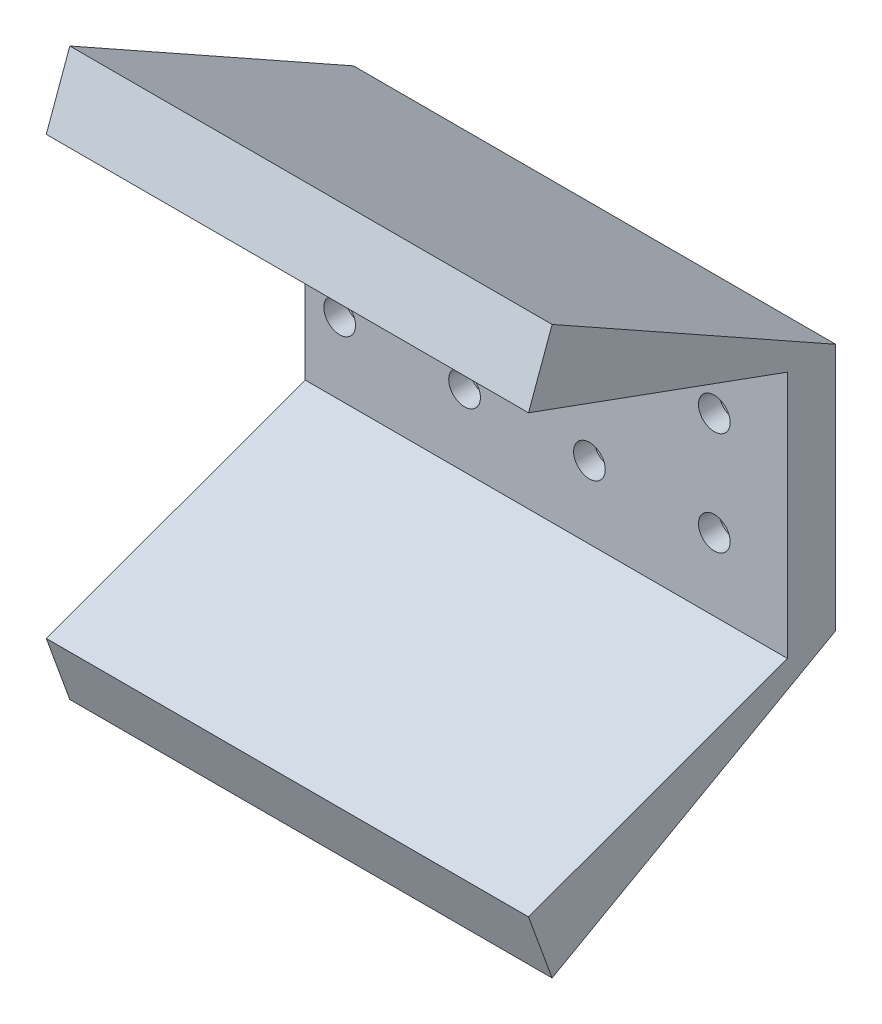
ISO-10303-21;
HEADER;
FILE_DESCRIPTION(('STEP AP214'),'2;1');
FILE_NAME('part.step','',(''),(''),'','','');
FILE_SCHEMA(('AUTOMOTIVE_DESIGN { 1 0 10303 214 1 1 1 1 }'));
ENDSEC;
DATA;
#1=APPLICATION_CONTEXT('core data for automotive mechanical design processes');
#2=APPLICATION_PROTOCOL_DEFINITION('international standard','automotive_design',2000,#1);
#3=PRODUCT_CONTEXT('',#1,'mechanical');
#4=PRODUCT('Part','Part','',(#3));
#5=PRODUCT_RELATED_PRODUCT_CATEGORY('part','',(#4));
#6=PRODUCT_DEFINITION_FORMATION('','',#4);
#7=PRODUCT_DEFINITION_CONTEXT('part definition',#1,'design');
#8=PRODUCT_DEFINITION('design','',#6,#7);
#9=PRODUCT_DEFINITION_SHAPE('','',#8);
#10=(LENGTH_UNIT() NAMED_UNIT(*) SI_UNIT(.MILLI.,.METRE.));
#11=(NAMED_UNIT(*) PLANE_ANGLE_UNIT() SI_UNIT($,.RADIAN.));
#12=(NAMED_UNIT(*) SI_UNIT($,.STERADIAN.) SOLID_ANGLE_UNIT());
#13=UNCERTAINTY_MEASURE_WITH_UNIT(LENGTH_MEASURE(1.E-05),#10,'distance_accuracy_value','');
#14=(GEOMETRIC_REPRESENTATION_CONTEXT(3) GLOBAL_UNCERTAINTY_ASSIGNED_CONTEXT((#13)) GLOBAL_UNIT_ASSIGNED_CONTEXT((#10,
#11,#12)) REPRESENTATION_CONTEXT('',''));
#15=CARTESIAN_POINT('',(0.,0.,0.));
#16=DIRECTION('',(0.,0.,1.));
#17=DIRECTION('',(1.,0.,0.));
#18=AXIS2_PLACEMENT_3D('',#15,#16,#17);
#19=CARTESIAN_POINT('',(5.,25.5,7.));
#20=DIRECTION('',(0.,0.,-1.));
#21=DIRECTION('',(-1.,0.,0.));
#22=AXIS2_PLACEMENT_3D('',#19,#20,#21);
#23=CYLINDRICAL_SURFACE('',#22,2.3);
#24=CARTESIAN_POINT('',(5.,25.5,7.));
#25=DIRECTION('',(0.,0.,1.));
#26=DIRECTION('',(1.,0.,0.));
#27=AXIS2_PLACEMENT_3D('',#24,#25,#26);
#28=CIRCLE('',#27,2.3);
#29=CARTESIAN_POINT('',(7.3,25.5,7.));
#30=VERTEX_POINT('',#29);
#31=EDGE_CURVE('E227',#30,#30,#28,.T.);
#32=ORIENTED_EDGE('',*,*,#31,.T.);
#33=EDGE_LOOP('',(#32));
#34=FACE_BOUND('',#33,.T.);
#35=CARTESIAN_POINT('',(5.,25.5,4.));
#36=DIRECTION('',(0.,0.,-1.));
#37=DIRECTION('',(-1.,0.,0.));
#38=AXIS2_PLACEMENT_3D('',#35,#36,#37);
#39=CIRCLE('',#38,2.3);
#40=CARTESIAN_POINT('',(2.7,25.5,4.));
#41=VERTEX_POINT('',#40);
#42=EDGE_CURVE('E47',#41,#41,#39,.T.);
#43=ORIENTED_EDGE('',*,*,#42,.T.);
#44=EDGE_LOOP('',(#43));
#45=FACE_BOUND('',#44,.T.);
#46=ADVANCED_FACE('F43',(#34,#45),#23,.F.);
#47=CARTESIAN_POINT('',(5.,10.5,7.));
#48=DIRECTION('',(0.,0.,-1.));
#49=DIRECTION('',(-1.,0.,0.));
#50=AXIS2_PLACEMENT_3D('',#47,#48,#49);
#51=CYLINDRICAL_SURFACE('',#50,2.3);
#52=CARTESIAN_POINT('',(5.,10.5,7.));
#53=DIRECTION('',(0.,0.,1.));
#54=DIRECTION('',(1.,0.,0.));
#55=AXIS2_PLACEMENT_3D('',#52,#53,#54);
#56=CIRCLE('',#55,2.3);
#57=CARTESIAN_POINT('',(7.3,10.5,7.));
#58=VERTEX_POINT('',#57);
#59=EDGE_CURVE('E224',#58,#58,#56,.T.);
#60=ORIENTED_EDGE('',*,*,#59,.T.);
#61=EDGE_LOOP('',(#60));
#62=FACE_BOUND('',#61,.T.);
#63=CARTESIAN_POINT('',(5.,10.5,4.));
#64=DIRECTION('',(0.,0.,-1.));
#65=DIRECTION('',(-1.,0.,0.));
#66=AXIS2_PLACEMENT_3D('',#63,#64,#65);
#67=CIRCLE('',#66,2.3);
#68=CARTESIAN_POINT('',(2.7,10.5,4.));
#69=VERTEX_POINT('',#68);
#70=EDGE_CURVE('E256',#69,#69,#67,.T.);
#71=ORIENTED_EDGE('',*,*,#70,.T.);
#72=EDGE_LOOP('',(#71));
#73=FACE_BOUND('',#72,.T.);
#74=ADVANCED_FACE('F329',(#62,#73),#51,.F.);
#75=CARTESIAN_POINT('',(23.125,25.5,7.));
#76=DIRECTION('',(0.,0.,-1.));
#77=DIRECTION('',(-1.,0.,0.));
#78=AXIS2_PLACEMENT_3D('',#75,#76,#77);
#79=CYLINDRICAL_SURFACE('',#78,2.3);
#80=CARTESIAN_POINT('',(23.125,25.5,7.));
#81=DIRECTION('',(0.,0.,1.));
#82=DIRECTION('',(1.,0.,0.));
#83=AXIS2_PLACEMENT_3D('',#80,#81,#82);
#84=CIRCLE('',#83,2.3);
#85=CARTESIAN_POINT('',(25.425,25.5,7.));
#86=VERTEX_POINT('',#85);
#87=EDGE_CURVE('E221',#86,#86,#84,.T.);
#88=ORIENTED_EDGE('',*,*,#87,.T.);
#89=EDGE_LOOP('',(#88));
#90=FACE_BOUND('',#89,.T.);
#91=CARTESIAN_POINT('',(23.125,25.5,4.));
#92=DIRECTION('',(0.,0.,-1.));
#93=DIRECTION('',(-1.,0.,0.));
#94=AXIS2_PLACEMENT_3D('',#91,#92,#93);
#95=CIRCLE('',#94,2.3);
#96=CARTESIAN_POINT('',(20.825,25.5,4.));
#97=VERTEX_POINT('',#96);
#98=EDGE_CURVE('E254',#97,#97,#95,.T.);
#99=ORIENTED_EDGE('',*,*,#98,.T.);
#100=EDGE_LOOP('',(#99));
#101=FACE_BOUND('',#100,.T.);
#102=ADVANCED_FACE('F335',(#90,#101),#79,.F.);
#103=CARTESIAN_POINT('',(23.125,10.5,7.));
#104=DIRECTION('',(0.,0.,-1.));
#105=DIRECTION('',(-1.,0.,0.));
#106=AXIS2_PLACEMENT_3D('',#103,#104,#105);
#107=CYLINDRICAL_SURFACE('',#106,2.3);
#108=CARTESIAN_POINT('',(23.125,10.5,7.));
#109=DIRECTION('',(0.,0.,1.));
#110=DIRECTION('',(1.,0.,0.));
#111=AXIS2_PLACEMENT_3D('',#108,#109,#110);
#112=CIRCLE('',#111,2.3);
#113=CARTESIAN_POINT('',(25.425,10.5,7.));
#114=VERTEX_POINT('',#113);
#115=EDGE_CURVE('E218',#114,#114,#112,.T.);
#116=ORIENTED_EDGE('',*,*,#115,.T.);
#117=EDGE_LOOP('',(#116));
#118=FACE_BOUND('',#117,.T.);
#119=CARTESIAN_POINT('',(23.125,10.5,4.));
#120=DIRECTION('',(0.,0.,-1.));
#121=DIRECTION('',(-1.,0.,0.));
#122=AXIS2_PLACEMENT_3D('',#119,#120,#121);
#123=CIRCLE('',#122,2.3);
#124=CARTESIAN_POINT('',(20.825,10.5,4.));
#125=VERTEX_POINT('',#124);
#126=EDGE_CURVE('E251',#125,#125,#123,.T.);
#127=ORIENTED_EDGE('',*,*,#126,.T.);
#128=EDGE_LOOP('',(#127));
#129=FACE_BOUND('',#128,.T.);
#130=ADVANCED_FACE('F393',(#118,#129),#107,.F.);
#131=CARTESIAN_POINT('',(41.25,25.5,7.));
#132=DIRECTION('',(0.,0.,-1.));
#133=DIRECTION('',(-1.,0.,0.));
#134=AXIS2_PLACEMENT_3D('',#131,#132,#133);
#135=CYLINDRICAL_SURFACE('',#134,2.3);
#136=CARTESIAN_POINT('',(41.25,25.5,7.));
#137=DIRECTION('',(0.,0.,1.));
#138=DIRECTION('',(1.,0.,0.));
#139=AXIS2_PLACEMENT_3D('',#136,#137,#138);
#140=CIRCLE('',#139,2.3);
#141=CARTESIAN_POINT('',(43.55,25.5,7.));
#142=VERTEX_POINT('',#141);
#143=EDGE_CURVE('E215',#142,#142,#140,.T.);
#144=ORIENTED_EDGE('',*,*,#143,.T.);
#145=EDGE_LOOP('',(#144));
#146=FACE_BOUND('',#145,.T.);
#147=CARTESIAN_POINT('',(41.25,25.5,4.));
#148=DIRECTION('',(0.,0.,-1.));
#149=DIRECTION('',(-1.,0.,0.));
#150=AXIS2_PLACEMENT_3D('',#147,#148,#149);
#151=CIRCLE('',#150,2.3);
#152=CARTESIAN_POINT('',(38.95,25.5,4.));
#153=VERTEX_POINT('',#152);
#154=EDGE_CURVE('E248',#153,#153,#151,.T.);
#155=ORIENTED_EDGE('',*,*,#154,.T.);
#156=EDGE_LOOP('',(#155));
#157=FACE_BOUND('',#156,.T.);
#158=ADVANCED_FACE('F385',(#146,#157),#135,.F.);
#159=CARTESIAN_POINT('',(41.25,10.5,7.));
#160=DIRECTION('',(0.,0.,-1.));
#161=DIRECTION('',(-1.,0.,0.));
#162=AXIS2_PLACEMENT_3D('',#159,#160,#161);
#163=CYLINDRICAL_SURFACE('',#162,2.3);
#164=CARTESIAN_POINT('',(41.25,10.5,7.));
#165=DIRECTION('',(0.,0.,1.));
#166=DIRECTION('',(1.,0.,0.));
#167=AXIS2_PLACEMENT_3D('',#164,#165,#166);
#168=CIRCLE('',#167,2.3);
#169=CARTESIAN_POINT('',(43.55,10.5,7.));
#170=VERTEX_POINT('',#169);
#171=EDGE_CURVE('E212',#170,#170,#168,.T.);
#172=ORIENTED_EDGE('',*,*,#171,.T.);
#173=EDGE_LOOP('',(#172));
#174=FACE_BOUND('',#173,.T.);
#175=CARTESIAN_POINT('',(41.25,10.5,4.));
#176=DIRECTION('',(0.,0.,-1.));
#177=DIRECTION('',(-1.,0.,0.));
#178=AXIS2_PLACEMENT_3D('',#175,#176,#177);
#179=CIRCLE('',#178,2.3);
#180=CARTESIAN_POINT('',(38.95,10.5,4.));
#181=VERTEX_POINT('',#180);
#182=EDGE_CURVE('E245',#181,#181,#179,.T.);
#183=ORIENTED_EDGE('',*,*,#182,.T.);
#184=EDGE_LOOP('',(#183));
#185=FACE_BOUND('',#184,.T.);
#186=ADVANCED_FACE('F377',(#174,#185),#163,.F.);
#187=CARTESIAN_POINT('',(59.375,25.5,7.));
#188=DIRECTION('',(0.,0.,-1.));
#189=DIRECTION('',(-1.,0.,0.));
#190=AXIS2_PLACEMENT_3D('',#187,#188,#189);
#191=CYLINDRICAL_SURFACE('',#190,2.3);
#192=CARTESIAN_POINT('',(59.375,25.5,7.));
#193=DIRECTION('',(0.,0.,1.));
#194=DIRECTION('',(1.,0.,0.));
#195=AXIS2_PLACEMENT_3D('',#192,#193,#194);
#196=CIRCLE('',#195,2.3);
#197=CARTESIAN_POINT('',(61.675,25.5,7.));
#198=VERTEX_POINT('',#197);
#199=EDGE_CURVE('E209',#198,#198,#196,.T.);
#200=ORIENTED_EDGE('',*,*,#199,.T.);
#201=EDGE_LOOP('',(#200));
#202=FACE_BOUND('',#201,.T.);
#203=CARTESIAN_POINT('',(59.375,25.5,4.));
#204=DIRECTION('',(0.,0.,-1.));
#205=DIRECTION('',(-1.,0.,0.));
#206=AXIS2_PLACEMENT_3D('',#203,#204,#205);
#207=CIRCLE('',#206,2.3);
#208=CARTESIAN_POINT('',(57.075,25.5,4.));
#209=VERTEX_POINT('',#208);
#210=EDGE_CURVE('E242',#209,#209,#207,.T.);
#211=ORIENTED_EDGE('',*,*,#210,.T.);
#212=EDGE_LOOP('',(#211));
#213=FACE_BOUND('',#212,.T.);
#214=ADVANCED_FACE('F368',(#202,#213),#191,.F.);
#215=CARTESIAN_POINT('',(59.375,10.5,7.));
#216=DIRECTION('',(0.,0.,-1.));
#217=DIRECTION('',(-1.,0.,0.));
#218=AXIS2_PLACEMENT_3D('',#215,#216,#217);
#219=CYLINDRICAL_SURFACE('',#218,2.3);
#220=CARTESIAN_POINT('',(59.375,10.5,7.));
#221=DIRECTION('',(0.,0.,1.));
#222=DIRECTION('',(1.,0.,0.));
#223=AXIS2_PLACEMENT_3D('',#220,#221,#222);
#224=CIRCLE('',#223,2.3);
#225=CARTESIAN_POINT('',(61.675,10.5,7.));
#226=VERTEX_POINT('',#225);
#227=EDGE_CURVE('E206',#226,#226,#224,.T.);
#228=ORIENTED_EDGE('',*,*,#227,.T.);
#229=EDGE_LOOP('',(#228));
#230=FACE_BOUND('',#229,.T.);
#231=CARTESIAN_POINT('',(59.375,10.5,4.));
#232=DIRECTION('',(0.,0.,-1.));
#233=DIRECTION('',(-1.,0.,0.));
#234=AXIS2_PLACEMENT_3D('',#231,#232,#233);
#235=CIRCLE('',#234,2.3);
#236=CARTESIAN_POINT('',(57.075,10.5,4.));
#237=VERTEX_POINT('',#236);
#238=EDGE_CURVE('E203',#237,#237,#235,.T.);
#239=ORIENTED_EDGE('',*,*,#238,.T.);
#240=EDGE_LOOP('',(#239));
#241=FACE_BOUND('',#240,.T.);
#242=ADVANCED_FACE('F341',(#230,#241),#219,.F.);
#243=CARTESIAN_POINT('',(0.,0.,7.));
#244=DIRECTION('',(0.,0.,-1.));
#245=DIRECTION('',(-1.,0.,0.));
#246=AXIS2_PLACEMENT_3D('',#243,#244,#245);
#247=PLANE('',#246);
#248=DIRECTION('',(0.,-1.,0.));
#249=VECTOR('',#248,1.);
#250=CARTESIAN_POINT('',(0.,0.,7.));
#251=LINE('',#250,#249);
#252=CARTESIAN_POINT('',(0.,36.,7.));
#253=VERTEX_POINT('',#252);
#254=CARTESIAN_POINT('',(0.,0.,7.));
#255=VERTEX_POINT('',#254);
#256=EDGE_CURVE('E102',#253,#255,#251,.T.);
#257=ORIENTED_EDGE('',*,*,#256,.T.);
#258=DIRECTION('',(1.,0.,0.));
#259=VECTOR('',#258,1.);
#260=CARTESIAN_POINT('',(0.,0.,7.));
#261=LINE('',#260,#259);
#262=CARTESIAN_POINT('',(70.,0.,7.));
#263=VERTEX_POINT('',#262);
#264=EDGE_CURVE('E98',#255,#263,#261,.T.);
#265=ORIENTED_EDGE('',*,*,#264,.T.);
#266=DIRECTION('',(0.,1.,0.));
#267=VECTOR('',#266,1.);
#268=CARTESIAN_POINT('',(70.,0.,7.));
#269=LINE('',#268,#267);
#270=CARTESIAN_POINT('',(70.,36.,7.));
#271=VERTEX_POINT('',#270);
#272=EDGE_CURVE('E53',#263,#271,#269,.T.);
#273=ORIENTED_EDGE('',*,*,#272,.T.);
#274=DIRECTION('',(-1.,0.,0.));
#275=VECTOR('',#274,1.);
#276=CARTESIAN_POINT('',(0.,36.,7.));
#277=LINE('',#276,#275);
#278=EDGE_CURVE('E11',#271,#253,#277,.T.);
#279=ORIENTED_EDGE('',*,*,#278,.T.);
#280=EDGE_LOOP('',(#257,#265,#273,#279));
#281=FACE_BOUND('',#280,.T.);
#282=ORIENTED_EDGE('',*,*,#31,.F.);
#283=EDGE_LOOP('',(#282));
#284=FACE_BOUND('',#283,.T.);
#285=ORIENTED_EDGE('',*,*,#59,.F.);
#286=EDGE_LOOP('',(#285));
#287=FACE_BOUND('',#286,.T.);
#288=ORIENTED_EDGE('',*,*,#87,.F.);
#289=EDGE_LOOP('',(#288));
#290=FACE_BOUND('',#289,.T.);
#291=ORIENTED_EDGE('',*,*,#115,.F.);
#292=EDGE_LOOP('',(#291));
#293=FACE_BOUND('',#292,.T.);
#294=ORIENTED_EDGE('',*,*,#143,.F.);
#295=EDGE_LOOP('',(#294));
#296=FACE_BOUND('',#295,.T.);
#297=ORIENTED_EDGE('',*,*,#171,.F.);
#298=EDGE_LOOP('',(#297));
#299=FACE_BOUND('',#298,.T.);
#300=ORIENTED_EDGE('',*,*,#199,.F.);
#301=EDGE_LOOP('',(#300));
#302=FACE_BOUND('',#301,.T.);
#303=ORIENTED_EDGE('',*,*,#227,.F.);
#304=EDGE_LOOP('',(#303));
#305=FACE_BOUND('',#304,.T.);
#306=ADVANCED_FACE('F100',(#281,#284,#287,#290,#293,#296,#299,#302,#305),#247,.F.);
#307=CARTESIAN_POINT('',(0.,0.,0.));
#308=DIRECTION('',(0.,0.,-1.));
#309=DIRECTION('',(-1.,0.,0.));
#310=AXIS2_PLACEMENT_3D('',#307,#308,#309);
#311=PLANE('',#310);
#312=CARTESIAN_POINT('',(41.25,25.5,0.));
#313=DIRECTION('',(0.,0.,-1.));
#314=DIRECTION('',(-1.,0.,0.));
#315=AXIS2_PLACEMENT_3D('',#312,#313,#314);
#316=CIRCLE('',#315,4.00000000000001);
#317=CARTESIAN_POINT('',(37.25,25.5,0.));
#318=VERTEX_POINT('',#317);
#319=EDGE_CURVE('E176',#318,#318,#316,.T.);
#320=ORIENTED_EDGE('',*,*,#319,.F.);
#321=EDGE_LOOP('',(#320));
#322=FACE_BOUND('',#321,.T.);
#323=CARTESIAN_POINT('',(23.125,25.5,0.));
#324=DIRECTION('',(0.,0.,-1.));
#325=DIRECTION('',(-1.,0.,0.));
#326=AXIS2_PLACEMENT_3D('',#323,#324,#325);
#327=CIRCLE('',#326,4.);
#328=CARTESIAN_POINT('',(19.125,25.5,0.));
#329=VERTEX_POINT('',#328);
#330=EDGE_CURVE('E183',#329,#329,#327,.T.);
#331=ORIENTED_EDGE('',*,*,#330,.F.);
#332=EDGE_LOOP('',(#331));
#333=FACE_BOUND('',#332,.T.);
#334=CARTESIAN_POINT('',(5.,25.5,0.));
#335=DIRECTION('',(0.,0.,-1.));
#336=DIRECTION('',(-1.,0.,0.));
#337=AXIS2_PLACEMENT_3D('',#334,#335,#336);
#338=CIRCLE('',#337,4.);
#339=CARTESIAN_POINT('',(0.999999999999996,25.5,0.));
#340=VERTEX_POINT('',#339);
#341=EDGE_CURVE('E189',#340,#340,#338,.T.);
#342=ORIENTED_EDGE('',*,*,#341,.F.);
#343=EDGE_LOOP('',(#342));
#344=FACE_BOUND('',#343,.T.);
#345=CARTESIAN_POINT('',(5.,10.5,0.));
#346=DIRECTION('',(0.,0.,-1.));
#347=DIRECTION('',(-1.,0.,0.));
#348=AXIS2_PLACEMENT_3D('',#345,#346,#347);
#349=CIRCLE('',#348,4.);
#350=CARTESIAN_POINT('',(0.999999999999997,10.5,0.));
#351=VERTEX_POINT('',#350);
#352=EDGE_CURVE('E195',#351,#351,#349,.T.);
#353=ORIENTED_EDGE('',*,*,#352,.F.);
#354=EDGE_LOOP('',(#353));
#355=FACE_BOUND('',#354,.T.);
#356=CARTESIAN_POINT('',(23.125,10.5,0.));
#357=DIRECTION('',(0.,0.,-1.));
#358=DIRECTION('',(-1.,0.,0.));
#359=AXIS2_PLACEMENT_3D('',#356,#357,#358);
#360=CIRCLE('',#359,4.);
#361=CARTESIAN_POINT('',(19.125,10.5,0.));
#362=VERTEX_POINT('',#361);
#363=EDGE_CURVE('E158',#362,#362,#360,.T.);
#364=ORIENTED_EDGE('',*,*,#363,.F.);
#365=EDGE_LOOP('',(#364));
#366=FACE_BOUND('',#365,.T.);
#367=CARTESIAN_POINT('',(41.25,10.5,0.));
#368=DIRECTION('',(0.,0.,-1.));
#369=DIRECTION('',(-1.,0.,0.));
#370=AXIS2_PLACEMENT_3D('',#367,#368,#369);
#371=CIRCLE('',#370,4.00000000000001);
#372=CARTESIAN_POINT('',(37.25,10.5,0.));
#373=VERTEX_POINT('',#372);
#374=EDGE_CURVE('E165',#373,#373,#371,.T.);
#375=ORIENTED_EDGE('',*,*,#374,.F.);
#376=EDGE_LOOP('',(#375));
#377=FACE_BOUND('',#376,.T.);
#378=CARTESIAN_POINT('',(59.375,10.5,0.));
#379=DIRECTION('',(0.,0.,-1.));
#380=DIRECTION('',(-1.,0.,0.));
#381=AXIS2_PLACEMENT_3D('',#378,#379,#380);
#382=CIRCLE('',#381,4.);
#383=CARTESIAN_POINT('',(55.375,10.5,0.));
#384=VERTEX_POINT('',#383);
#385=EDGE_CURVE('E171',#384,#384,#382,.T.);
#386=ORIENTED_EDGE('',*,*,#385,.F.);
#387=EDGE_LOOP('',(#386));
#388=FACE_BOUND('',#387,.T.);
#389=CARTESIAN_POINT('',(59.375,25.5,0.));
#390=DIRECTION('',(0.,0.,-1.));
#391=DIRECTION('',(-1.,0.,0.));
#392=AXIS2_PLACEMENT_3D('',#389,#390,#391);
#393=CIRCLE('',#392,4.00000000000001);
#394=CARTESIAN_POINT('',(55.375,25.5,0.));
#395=VERTEX_POINT('',#394);
#396=EDGE_CURVE('E179',#395,#395,#393,.T.);
#397=ORIENTED_EDGE('',*,*,#396,.F.);
#398=EDGE_LOOP('',(#397));
#399=FACE_BOUND('',#398,.T.);
#400=DIRECTION('',(0.,-1.,0.));
#401=VECTOR('',#400,1.);
#402=CARTESIAN_POINT('',(0.,0.,0.));
#403=LINE('',#402,#401);
#404=CARTESIAN_POINT('',(0.,36.,0.));
#405=VERTEX_POINT('',#404);
#406=CARTESIAN_POINT('',(0.,0.,0.));
#407=VERTEX_POINT('',#406);
#408=EDGE_CURVE('E230',#405,#407,#403,.T.);
#409=ORIENTED_EDGE('',*,*,#408,.F.);
#410=DIRECTION('',(-1.,0.,0.));
#411=VECTOR('',#410,1.);
#412=CARTESIAN_POINT('',(0.,36.,0.));
#413=LINE('',#412,#411);
#414=CARTESIAN_POINT('',(70.,36.,0.));
#415=VERTEX_POINT('',#414);
#416=EDGE_CURVE('E231',#415,#405,#413,.T.);
#417=ORIENTED_EDGE('',*,*,#416,.F.);
#418=DIRECTION('',(0.,1.,0.));
#419=VECTOR('',#418,1.);
#420=CARTESIAN_POINT('',(70.,0.,0.));
#421=LINE('',#420,#419);
#422=CARTESIAN_POINT('',(70.,0.,0.));
#423=VERTEX_POINT('',#422);
#424=EDGE_CURVE('E72',#423,#415,#421,.T.);
#425=ORIENTED_EDGE('',*,*,#424,.F.);
#426=DIRECTION('',(1.,0.,0.));
#427=VECTOR('',#426,1.);
#428=CARTESIAN_POINT('',(0.,0.,0.));
#429=LINE('',#428,#427);
#430=EDGE_CURVE('E235',#407,#423,#429,.T.);
#431=ORIENTED_EDGE('',*,*,#430,.F.);
#432=EDGE_LOOP('',(#409,#417,#425,#431));
#433=FACE_BOUND('',#432,.T.);
#434=ADVANCED_FACE('F278',(#322,#333,#344,#355,#366,#377,#388,#399,#433),#311,.T.);
#435=CARTESIAN_POINT('',(0.,0.,7.));
#436=DIRECTION('',(1.,0.,0.));
#437=DIRECTION('',(0.,1.,0.));
#438=AXIS2_PLACEMENT_3D('',#435,#436,#437);
#439=PLANE('',#438);
#440=ORIENTED_EDGE('',*,*,#408,.T.);
#441=DIRECTION('',(0.,0.488989320398652,-0.872289770968378));
#442=VECTOR('',#441,1.);
#443=CARTESIAN_POINT('',(0.,0.,0.));
#444=LINE('',#443,#442);
#445=CARTESIAN_POINT('',(0.,-23.077731940886,41.1675033981796));
#446=VERTEX_POINT('',#445);
#447=EDGE_CURVE('E127',#446,#407,#444,.T.);
#448=ORIENTED_EDGE('',*,*,#447,.F.);
#449=DIRECTION('',(0.,-0.939692620785908,-0.342020143325671));
#450=VECTOR('',#449,1.);
#451=CARTESIAN_POINT('',(0.,-15.9305623669298,43.7688603823527));
#452=LINE('',#451,#450);
#453=CARTESIAN_POINT('',(0.,-13.6808057330269,44.5877048314363));
#454=VERTEX_POINT('',#453);
#455=EDGE_CURVE('E123',#454,#446,#452,.T.);
#456=ORIENTED_EDGE('',*,*,#455,.F.);
#457=DIRECTION('',(0.,-0.342020143325673,0.939692620785907));
#458=VECTOR('',#457,1.);
#459=CARTESIAN_POINT('',(0.,2.24975663390293,0.818844449083604));
#460=LINE('',#459,#458);
#461=EDGE_CURVE('E139',#255,#454,#460,.T.);
#462=ORIENTED_EDGE('',*,*,#461,.F.);
#463=ORIENTED_EDGE('',*,*,#256,.F.);
#464=DIRECTION('',(0.,0.342020143325665,0.93969262078591));
#465=VECTOR('',#464,1.);
#466=CARTESIAN_POINT('',(0.,29.5390433422388,-10.7513325252741));
#467=LINE('',#466,#465);
#468=CARTESIAN_POINT('',(0.,49.6808057330266,44.5877048314364));
#469=VERTEX_POINT('',#468);
#470=EDGE_CURVE('E82',#253,#469,#467,.T.);
#471=ORIENTED_EDGE('',*,*,#470,.T.);
#472=DIRECTION('',(0.,0.939692620785909,-0.342020143325666));
#473=VECTOR('',#472,1.);
#474=CARTESIAN_POINT('',(0.,20.1417623907879,55.3390373567105));
#475=LINE('',#474,#473);
#476=CARTESIAN_POINT('',(0.,59.0777319408858,41.1675033981797));
#477=VERTEX_POINT('',#476);
#478=EDGE_CURVE('E143',#469,#477,#475,.T.);
#479=ORIENTED_EDGE('',*,*,#478,.T.);
#480=DIRECTION('',(0.,-0.488989320398647,-0.87228977096838));
#481=VECTOR('',#480,1.);
#482=CARTESIAN_POINT('',(0.,27.3920200032985,-15.3554537626747));
#483=LINE('',#482,#481);
#484=EDGE_CURVE('E140',#477,#405,#483,.T.);
#485=ORIENTED_EDGE('',*,*,#484,.T.);
#486=EDGE_LOOP('',(#440,#448,#456,#462,#463,#471,#479,#485));
#487=FACE_BOUND('',#486,.T.);
#488=ADVANCED_FACE('F45',(#487),#439,.F.);
#489=CARTESIAN_POINT('',(70.,0.,7.));
#490=DIRECTION('',(-1.,0.,0.));
#491=DIRECTION('',(0.,-1.,0.));
#492=AXIS2_PLACEMENT_3D('',#489,#490,#491);
#493=PLANE('',#492);
#494=ORIENTED_EDGE('',*,*,#424,.T.);
#495=DIRECTION('',(0.,-0.488989320398647,-0.87228977096838));
#496=VECTOR('',#495,1.);
#497=CARTESIAN_POINT('',(70.,27.3920200032985,-15.3554537626747));
#498=LINE('',#497,#496);
#499=CARTESIAN_POINT('',(70.,59.0777319408857,41.1675033981797));
#500=VERTEX_POINT('',#499);
#501=EDGE_CURVE('E135',#500,#415,#498,.T.);
#502=ORIENTED_EDGE('',*,*,#501,.F.);
#503=DIRECTION('',(0.,0.939692620785909,-0.342020143325666));
#504=VECTOR('',#503,1.);
#505=CARTESIAN_POINT('',(70.,20.1417623907878,55.3390373567105));
#506=LINE('',#505,#504);
#507=CARTESIAN_POINT('',(70.,49.6808057330266,44.5877048314364));
#508=VERTEX_POINT('',#507);
#509=EDGE_CURVE('E149',#508,#500,#506,.T.);
#510=ORIENTED_EDGE('',*,*,#509,.F.);
#511=DIRECTION('',(0.,0.342020143325665,0.93969262078591));
#512=VECTOR('',#511,1.);
#513=CARTESIAN_POINT('',(70.,29.5390433422388,-10.7513325252741));
#514=LINE('',#513,#512);
#515=EDGE_CURVE('E116',#271,#508,#514,.T.);
#516=ORIENTED_EDGE('',*,*,#515,.F.);
#517=ORIENTED_EDGE('',*,*,#272,.F.);
#518=DIRECTION('',(0.,-0.342020143325673,0.939692620785907));
#519=VECTOR('',#518,1.);
#520=CARTESIAN_POINT('',(70.,2.24975663390291,0.818844449083604));
#521=LINE('',#520,#519);
#522=CARTESIAN_POINT('',(70.,-13.6808057330269,44.5877048314363));
#523=VERTEX_POINT('',#522);
#524=EDGE_CURVE('E114',#263,#523,#521,.T.);
#525=ORIENTED_EDGE('',*,*,#524,.T.);
#526=DIRECTION('',(0.,-0.939692620785908,-0.342020143325671));
#527=VECTOR('',#526,1.);
#528=CARTESIAN_POINT('',(70.,-15.9305623669298,43.7688603823527));
#529=LINE('',#528,#527);
#530=CARTESIAN_POINT('',(70.,-23.077731940886,41.1675033981796));
#531=VERTEX_POINT('',#530);
#532=EDGE_CURVE('E130',#523,#531,#529,.T.);
#533=ORIENTED_EDGE('',*,*,#532,.T.);
#534=DIRECTION('',(0.,0.488989320398652,-0.872289770968378));
#535=VECTOR('',#534,1.);
#536=CARTESIAN_POINT('',(70.,0.,0.));
#537=LINE('',#536,#535);
#538=EDGE_CURVE('E124',#531,#423,#537,.T.);
#539=ORIENTED_EDGE('',*,*,#538,.T.);
#540=EDGE_LOOP('',(#494,#502,#510,#516,#517,#525,#533,#539));
#541=FACE_BOUND('',#540,.T.);
#542=ADVANCED_FACE('F111',(#541),#493,.F.);
#543=CARTESIAN_POINT('',(59.375,10.5,4.));
#544=DIRECTION('',(0.,0.,-1.));
#545=DIRECTION('',(-1.,0.,0.));
#546=AXIS2_PLACEMENT_3D('',#543,#544,#545);
#547=CYLINDRICAL_SURFACE('',#546,4.);
#548=CARTESIAN_POINT('',(59.375,10.5,4.));
#549=DIRECTION('',(0.,0.,-1.));
#550=DIRECTION('',(-1.,0.,0.));
#551=AXIS2_PLACEMENT_3D('',#548,#549,#550);
#552=CIRCLE('',#551,4.);
#553=CARTESIAN_POINT('',(55.375,10.5,4.));
#554=VERTEX_POINT('',#553);
#555=EDGE_CURVE('E155',#554,#554,#552,.T.);
#556=ORIENTED_EDGE('',*,*,#555,.F.);
#557=EDGE_LOOP('',(#556));
#558=FACE_BOUND('',#557,.T.);
#559=ORIENTED_EDGE('',*,*,#385,.T.);
#560=EDGE_LOOP('',(#559));
#561=FACE_BOUND('',#560,.T.);
#562=ADVANCED_FACE('F343',(#558,#561),#547,.F.);
#563=CARTESIAN_POINT('',(59.375,10.5,4.));
#564=DIRECTION('',(0.,0.,-1.));
#565=DIRECTION('',(-1.,0.,0.));
#566=AXIS2_PLACEMENT_3D('',#563,#564,#565);
#567=PLANE('',#566);
#568=ORIENTED_EDGE('',*,*,#238,.F.);
#569=EDGE_LOOP('',(#568));
#570=FACE_BOUND('',#569,.T.);
#571=ORIENTED_EDGE('',*,*,#555,.T.);
#572=EDGE_LOOP('',(#571));
#573=FACE_BOUND('',#572,.T.);
#574=ADVANCED_FACE('F348',(#570,#573),#567,.T.);
#575=CARTESIAN_POINT('',(59.375,25.5,4.));
#576=DIRECTION('',(0.,0.,-1.));
#577=DIRECTION('',(-1.,0.,0.));
#578=AXIS2_PLACEMENT_3D('',#575,#576,#577);
#579=CYLINDRICAL_SURFACE('',#578,4.00000000000001);
#580=CARTESIAN_POINT('',(59.375,25.5,4.));
#581=DIRECTION('',(0.,0.,-1.));
#582=DIRECTION('',(-1.,0.,0.));
#583=AXIS2_PLACEMENT_3D('',#580,#581,#582);
#584=CIRCLE('',#583,4.00000000000001);
#585=CARTESIAN_POINT('',(55.375,25.5,4.));
#586=VERTEX_POINT('',#585);
#587=EDGE_CURVE('E200',#586,#586,#584,.T.);
#588=ORIENTED_EDGE('',*,*,#587,.F.);
#589=EDGE_LOOP('',(#588));
#590=FACE_BOUND('',#589,.T.);
#591=ORIENTED_EDGE('',*,*,#396,.T.);
#592=EDGE_LOOP('',(#591));
#593=FACE_BOUND('',#592,.T.);
#594=ADVANCED_FACE('F432',(#590,#593),#579,.F.);
#595=CARTESIAN_POINT('',(59.375,25.5,4.));
#596=DIRECTION('',(0.,0.,-1.));
#597=DIRECTION('',(-1.,0.,0.));
#598=AXIS2_PLACEMENT_3D('',#595,#596,#597);
#599=PLANE('',#598);
#600=ORIENTED_EDGE('',*,*,#210,.F.);
#601=EDGE_LOOP('',(#600));
#602=FACE_BOUND('',#601,.T.);
#603=ORIENTED_EDGE('',*,*,#587,.T.);
#604=EDGE_LOOP('',(#603));
#605=FACE_BOUND('',#604,.T.);
#606=ADVANCED_FACE('F442',(#602,#605),#599,.T.);
#607=CARTESIAN_POINT('',(41.25,10.5,4.));
#608=DIRECTION('',(0.,0.,-1.));
#609=DIRECTION('',(-1.,0.,0.));
#610=AXIS2_PLACEMENT_3D('',#607,#608,#609);
#611=CYLINDRICAL_SURFACE('',#610,4.00000000000001);
#612=CARTESIAN_POINT('',(41.25,10.5,4.));
#613=DIRECTION('',(0.,0.,-1.));
#614=DIRECTION('',(-1.,0.,0.));
#615=AXIS2_PLACEMENT_3D('',#612,#613,#614);
#616=CIRCLE('',#615,4.00000000000001);
#617=CARTESIAN_POINT('',(37.25,10.5,4.));
#618=VERTEX_POINT('',#617);
#619=EDGE_CURVE('E168',#618,#618,#616,.T.);
#620=ORIENTED_EDGE('',*,*,#619,.F.);
#621=EDGE_LOOP('',(#620));
#622=FACE_BOUND('',#621,.T.);
#623=ORIENTED_EDGE('',*,*,#374,.T.);
#624=EDGE_LOOP('',(#623));
#625=FACE_BOUND('',#624,.T.);
#626=ADVANCED_FACE('F452',(#622,#625),#611,.F.);
#627=CARTESIAN_POINT('',(41.25,10.5,4.));
#628=DIRECTION('',(0.,0.,-1.));
#629=DIRECTION('',(-1.,0.,0.));
#630=AXIS2_PLACEMENT_3D('',#627,#628,#629);
#631=PLANE('',#630);
#632=ORIENTED_EDGE('',*,*,#182,.F.);
#633=EDGE_LOOP('',(#632));
#634=FACE_BOUND('',#633,.T.);
#635=ORIENTED_EDGE('',*,*,#619,.T.);
#636=EDGE_LOOP('',(#635));
#637=FACE_BOUND('',#636,.T.);
#638=ADVANCED_FACE('F462',(#634,#637),#631,.T.);
#639=CARTESIAN_POINT('',(41.25,25.5,4.));
#640=DIRECTION('',(0.,0.,-1.));
#641=DIRECTION('',(-1.,0.,0.));
#642=AXIS2_PLACEMENT_3D('',#639,#640,#641);
#643=CYLINDRICAL_SURFACE('',#642,4.00000000000001);
#644=CARTESIAN_POINT('',(41.25,25.5,4.));
#645=DIRECTION('',(0.,0.,-1.));
#646=DIRECTION('',(-1.,0.,0.));
#647=AXIS2_PLACEMENT_3D('',#644,#645,#646);
#648=CIRCLE('',#647,4.00000000000001);
#649=CARTESIAN_POINT('',(37.25,25.5,4.));
#650=VERTEX_POINT('',#649);
#651=EDGE_CURVE('E180',#650,#650,#648,.T.);
#652=ORIENTED_EDGE('',*,*,#651,.F.);
#653=EDGE_LOOP('',(#652));
#654=FACE_BOUND('',#653,.T.);
#655=ORIENTED_EDGE('',*,*,#319,.T.);
#656=EDGE_LOOP('',(#655));
#657=FACE_BOUND('',#656,.T.);
#658=ADVANCED_FACE('F472',(#654,#657),#643,.F.);
#659=CARTESIAN_POINT('',(41.25,25.5,4.));
#660=DIRECTION('',(0.,0.,-1.));
#661=DIRECTION('',(-1.,0.,0.));
#662=AXIS2_PLACEMENT_3D('',#659,#660,#661);
#663=PLANE('',#662);
#664=ORIENTED_EDGE('',*,*,#154,.F.);
#665=EDGE_LOOP('',(#664));
#666=FACE_BOUND('',#665,.T.);
#667=ORIENTED_EDGE('',*,*,#651,.T.);
#668=EDGE_LOOP('',(#667));
#669=FACE_BOUND('',#668,.T.);
#670=ADVANCED_FACE('F482',(#666,#669),#663,.T.);
#671=CARTESIAN_POINT('',(23.125,10.5,4.));
#672=DIRECTION('',(0.,0.,-1.));
#673=DIRECTION('',(-1.,0.,0.));
#674=AXIS2_PLACEMENT_3D('',#671,#672,#673);
#675=CYLINDRICAL_SURFACE('',#674,4.);
#676=CARTESIAN_POINT('',(23.125,10.5,4.));
#677=DIRECTION('',(0.,0.,-1.));
#678=DIRECTION('',(-1.,0.,0.));
#679=AXIS2_PLACEMENT_3D('',#676,#677,#678);
#680=CIRCLE('',#679,4.);
#681=CARTESIAN_POINT('',(19.125,10.5,4.));
#682=VERTEX_POINT('',#681);
#683=EDGE_CURVE('E162',#682,#682,#680,.T.);
#684=ORIENTED_EDGE('',*,*,#683,.F.);
#685=EDGE_LOOP('',(#684));
#686=FACE_BOUND('',#685,.T.);
#687=ORIENTED_EDGE('',*,*,#363,.T.);
#688=EDGE_LOOP('',(#687));
#689=FACE_BOUND('',#688,.T.);
#690=ADVANCED_FACE('F492',(#686,#689),#675,.F.);
#691=CARTESIAN_POINT('',(23.125,10.5,4.));
#692=DIRECTION('',(0.,0.,-1.));
#693=DIRECTION('',(-1.,0.,0.));
#694=AXIS2_PLACEMENT_3D('',#691,#692,#693);
#695=PLANE('',#694);
#696=ORIENTED_EDGE('',*,*,#126,.F.);
#697=EDGE_LOOP('',(#696));
#698=FACE_BOUND('',#697,.T.);
#699=ORIENTED_EDGE('',*,*,#683,.T.);
#700=EDGE_LOOP('',(#699));
#701=FACE_BOUND('',#700,.T.);
#702=ADVANCED_FACE('F502',(#698,#701),#695,.T.);
#703=CARTESIAN_POINT('',(23.125,25.5,4.));
#704=DIRECTION('',(0.,0.,-1.));
#705=DIRECTION('',(-1.,0.,0.));
#706=AXIS2_PLACEMENT_3D('',#703,#704,#705);
#707=CYLINDRICAL_SURFACE('',#706,4.);
#708=CARTESIAN_POINT('',(23.125,25.5,4.));
#709=DIRECTION('',(0.,0.,-1.));
#710=DIRECTION('',(-1.,0.,0.));
#711=AXIS2_PLACEMENT_3D('',#708,#709,#710);
#712=CIRCLE('',#711,4.);
#713=CARTESIAN_POINT('',(19.125,25.5,4.));
#714=VERTEX_POINT('',#713);
#715=EDGE_CURVE('E186',#714,#714,#712,.T.);
#716=ORIENTED_EDGE('',*,*,#715,.F.);
#717=EDGE_LOOP('',(#716));
#718=FACE_BOUND('',#717,.T.);
#719=ORIENTED_EDGE('',*,*,#330,.T.);
#720=EDGE_LOOP('',(#719));
#721=FACE_BOUND('',#720,.T.);
#722=ADVANCED_FACE('F512',(#718,#721),#707,.F.);
#723=CARTESIAN_POINT('',(23.125,25.5,4.));
#724=DIRECTION('',(0.,0.,-1.));
#725=DIRECTION('',(-1.,0.,0.));
#726=AXIS2_PLACEMENT_3D('',#723,#724,#725);
#727=PLANE('',#726);
#728=ORIENTED_EDGE('',*,*,#98,.F.);
#729=EDGE_LOOP('',(#728));
#730=FACE_BOUND('',#729,.T.);
#731=ORIENTED_EDGE('',*,*,#715,.T.);
#732=EDGE_LOOP('',(#731));
#733=FACE_BOUND('',#732,.T.);
#734=ADVANCED_FACE('F522',(#730,#733),#727,.T.);
#735=CARTESIAN_POINT('',(5.,10.5,4.));
#736=DIRECTION('',(0.,0.,-1.));
#737=DIRECTION('',(-1.,0.,0.));
#738=AXIS2_PLACEMENT_3D('',#735,#736,#737);
#739=CYLINDRICAL_SURFACE('',#738,4.);
#740=CARTESIAN_POINT('',(5.,10.5,4.));
#741=DIRECTION('',(0.,0.,-1.));
#742=DIRECTION('',(-1.,0.,0.));
#743=AXIS2_PLACEMENT_3D('',#740,#741,#742);
#744=CIRCLE('',#743,4.);
#745=CARTESIAN_POINT('',(0.999999999999997,10.5,4.));
#746=VERTEX_POINT('',#745);
#747=EDGE_CURVE('E161',#746,#746,#744,.T.);
#748=ORIENTED_EDGE('',*,*,#747,.F.);
#749=EDGE_LOOP('',(#748));
#750=FACE_BOUND('',#749,.T.);
#751=ORIENTED_EDGE('',*,*,#352,.T.);
#752=EDGE_LOOP('',(#751));
#753=FACE_BOUND('',#752,.T.);
#754=ADVANCED_FACE('F532',(#750,#753),#739,.F.);
#755=CARTESIAN_POINT('',(5.,10.5,4.));
#756=DIRECTION('',(0.,0.,-1.));
#757=DIRECTION('',(-1.,0.,0.));
#758=AXIS2_PLACEMENT_3D('',#755,#756,#757);
#759=PLANE('',#758);
#760=ORIENTED_EDGE('',*,*,#70,.F.);
#761=EDGE_LOOP('',(#760));
#762=FACE_BOUND('',#761,.T.);
#763=ORIENTED_EDGE('',*,*,#747,.T.);
#764=EDGE_LOOP('',(#763));
#765=FACE_BOUND('',#764,.T.);
#766=ADVANCED_FACE('F274',(#762,#765),#759,.T.);
#767=CARTESIAN_POINT('',(5.,25.5,4.));
#768=DIRECTION('',(0.,0.,-1.));
#769=DIRECTION('',(-1.,0.,0.));
#770=AXIS2_PLACEMENT_3D('',#767,#768,#769);
#771=CYLINDRICAL_SURFACE('',#770,4.);
#772=CARTESIAN_POINT('',(5.,25.5,4.));
#773=DIRECTION('',(0.,0.,-1.));
#774=DIRECTION('',(-1.,0.,0.));
#775=AXIS2_PLACEMENT_3D('',#772,#773,#774);
#776=CIRCLE('',#775,4.);
#777=CARTESIAN_POINT('',(0.999999999999996,25.5,4.));
#778=VERTEX_POINT('',#777);
#779=EDGE_CURVE('E192',#778,#778,#776,.T.);
#780=ORIENTED_EDGE('',*,*,#779,.F.);
#781=EDGE_LOOP('',(#780));
#782=FACE_BOUND('',#781,.T.);
#783=ORIENTED_EDGE('',*,*,#341,.T.);
#784=EDGE_LOOP('',(#783));
#785=FACE_BOUND('',#784,.T.);
#786=ADVANCED_FACE('F268',(#782,#785),#771,.F.);
#787=CARTESIAN_POINT('',(5.,25.5,4.));
#788=DIRECTION('',(0.,0.,-1.));
#789=DIRECTION('',(-1.,0.,0.));
#790=AXIS2_PLACEMENT_3D('',#787,#788,#789);
#791=PLANE('',#790);
#792=ORIENTED_EDGE('',*,*,#42,.F.);
#793=EDGE_LOOP('',(#792));
#794=FACE_BOUND('',#793,.T.);
#795=ORIENTED_EDGE('',*,*,#779,.T.);
#796=EDGE_LOOP('',(#795));
#797=FACE_BOUND('',#796,.T.);
#798=ADVANCED_FACE('F264',(#794,#797),#791,.T.);
#799=CARTESIAN_POINT('',(0.,27.3920200032985,-15.3554537626747));
#800=DIRECTION('',(0.,-0.87228977096838,0.488989320398647));
#801=DIRECTION('',(0.,-0.488989320398647,-0.87228977096838));
#802=AXIS2_PLACEMENT_3D('',#799,#800,#801);
#803=PLANE('',#802);
#804=ORIENTED_EDGE('',*,*,#501,.T.);
#805=ORIENTED_EDGE('',*,*,#416,.T.);
#806=ORIENTED_EDGE('',*,*,#484,.F.);
#807=DIRECTION('',(1.,0.,0.));
#808=VECTOR('',#807,1.);
#809=CARTESIAN_POINT('',(0.,59.0777319408858,41.1675033981797));
#810=LINE('',#809,#808);
#811=EDGE_CURVE('E146',#477,#500,#810,.T.);
#812=ORIENTED_EDGE('',*,*,#811,.T.);
#813=EDGE_LOOP('',(#804,#805,#806,#812));
#814=FACE_BOUND('',#813,.T.);
#815=ADVANCED_FACE('F267',(#814),#803,.F.);
#816=CARTESIAN_POINT('',(0.,29.5390433422388,-10.7513325252741));
#817=DIRECTION('',(0.,0.93969262078591,-0.342020143325665));
#818=DIRECTION('',(0.,0.342020143325665,0.93969262078591));
#819=AXIS2_PLACEMENT_3D('',#816,#817,#818);
#820=PLANE('',#819);
#821=ORIENTED_EDGE('',*,*,#515,.T.);
#822=DIRECTION('',(1.,0.,0.));
#823=VECTOR('',#822,1.);
#824=CARTESIAN_POINT('',(0.,49.6808057330266,44.5877048314364));
#825=LINE('',#824,#823);
#826=EDGE_CURVE('E152',#469,#508,#825,.T.);
#827=ORIENTED_EDGE('',*,*,#826,.F.);
#828=ORIENTED_EDGE('',*,*,#470,.F.);
#829=ORIENTED_EDGE('',*,*,#278,.F.);
#830=EDGE_LOOP('',(#821,#827,#828,#829));
#831=FACE_BOUND('',#830,.T.);
#832=ADVANCED_FACE('F316',(#831),#820,.F.);
#833=CARTESIAN_POINT('',(0.,20.1417623907879,55.3390373567105));
#834=DIRECTION('',(0.,-0.342020143325666,-0.939692620785909));
#835=DIRECTION('',(0.,0.939692620785909,-0.342020143325666));
#836=AXIS2_PLACEMENT_3D('',#833,#834,#835);
#837=PLANE('',#836);
#838=ORIENTED_EDGE('',*,*,#509,.T.);
#839=ORIENTED_EDGE('',*,*,#811,.F.);
#840=ORIENTED_EDGE('',*,*,#478,.F.);
#841=ORIENTED_EDGE('',*,*,#826,.T.);
#842=EDGE_LOOP('',(#838,#839,#840,#841));
#843=FACE_BOUND('',#842,.T.);
#844=ADVANCED_FACE('F318',(#843),#837,.F.);
#845=CARTESIAN_POINT('',(0.,-15.9305623669298,43.7688603823527));
#846=DIRECTION('',(0.,-0.342020143325671,0.939692620785907));
#847=DIRECTION('',(0.,-0.939692620785908,-0.342020143325671));
#848=AXIS2_PLACEMENT_3D('',#845,#846,#847);
#849=PLANE('',#848);
#850=ORIENTED_EDGE('',*,*,#532,.F.);
#851=DIRECTION('',(1.,0.,0.));
#852=VECTOR('',#851,1.);
#853=CARTESIAN_POINT('',(0.,-13.6808057330269,44.5877048314363));
#854=LINE('',#853,#852);
#855=EDGE_CURVE('E121',#454,#523,#854,.T.);
#856=ORIENTED_EDGE('',*,*,#855,.F.);
#857=ORIENTED_EDGE('',*,*,#455,.T.);
#858=DIRECTION('',(1.,0.,0.));
#859=VECTOR('',#858,1.);
#860=CARTESIAN_POINT('',(0.,-23.077731940886,41.1675033981796));
#861=LINE('',#860,#859);
#862=EDGE_CURVE('E136',#446,#531,#861,.T.);
#863=ORIENTED_EDGE('',*,*,#862,.T.);
#864=EDGE_LOOP('',(#850,#856,#857,#863));
#865=FACE_BOUND('',#864,.T.);
#866=ADVANCED_FACE('F312',(#865),#849,.T.);
#867=CARTESIAN_POINT('',(0.,2.24975663390293,0.818844449083604));
#868=DIRECTION('',(0.,0.939692620785907,0.342020143325673));
#869=DIRECTION('',(0.,-0.342020143325673,0.939692620785907));
#870=AXIS2_PLACEMENT_3D('',#867,#868,#869);
#871=PLANE('',#870);
#872=ORIENTED_EDGE('',*,*,#524,.F.);
#873=ORIENTED_EDGE('',*,*,#264,.F.);
#874=ORIENTED_EDGE('',*,*,#461,.T.);
#875=ORIENTED_EDGE('',*,*,#855,.T.);
#876=EDGE_LOOP('',(#872,#873,#874,#875));
#877=FACE_BOUND('',#876,.T.);
#878=ADVANCED_FACE('F119',(#877),#871,.T.);
#879=CARTESIAN_POINT('',(0.,0.,0.));
#880=DIRECTION('',(0.,-0.872289770968378,-0.488989320398652));
#881=DIRECTION('',(0.,0.488989320398652,-0.872289770968378));
#882=AXIS2_PLACEMENT_3D('',#879,#880,#881);
#883=PLANE('',#882);
#884=ORIENTED_EDGE('',*,*,#538,.F.);
#885=ORIENTED_EDGE('',*,*,#862,.F.);
#886=ORIENTED_EDGE('',*,*,#447,.T.);
#887=ORIENTED_EDGE('',*,*,#430,.T.);
#888=EDGE_LOOP('',(#884,#885,#886,#887));
#889=FACE_BOUND('',#888,.T.);
#890=ADVANCED_FACE('F304',(#889),#883,.T.);
#891=CLOSED_SHELL('',(#46,#74,#102,#130,#158,#186,#214,#242,#306,#434,#488,#542,#562,#574,#594,
#606,#626,#638,#658,#670,#690,#702,#722,#734,#754,#766,#786,#798,#815,#832,#844,#866,#878,#890));
#892=MANIFOLD_SOLID_BREP('B2',#891);
#893=ADVANCED_BREP_SHAPE_REPRESENTATION('',(#18,#892),#14);
#894=SHAPE_DEFINITION_REPRESENTATION(#9,#893);
ENDSEC;
END-ISO-10303-21;
